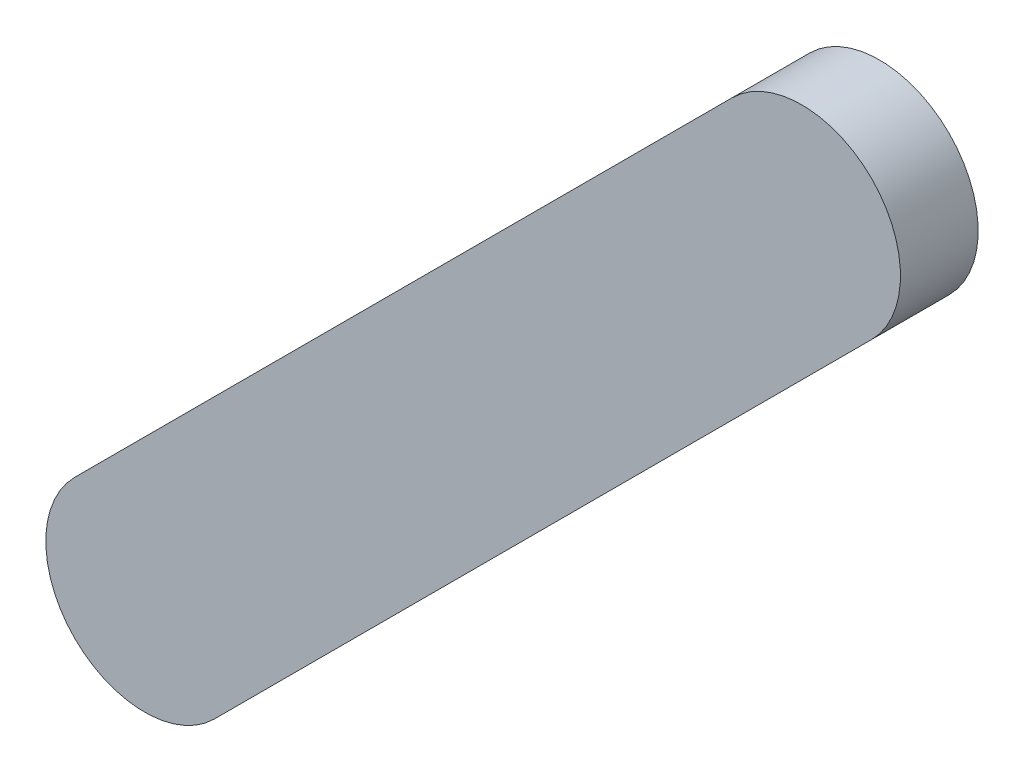
ISO-10303-21;
HEADER;
FILE_DESCRIPTION(('STEP AP214'),'2;1');
FILE_NAME('part.step','',(''),(''),'','','');
FILE_SCHEMA(('AUTOMOTIVE_DESIGN { 1 0 10303 214 1 1 1 1 }'));
ENDSEC;
DATA;
#1=APPLICATION_CONTEXT('core data for automotive mechanical design processes');
#2=APPLICATION_PROTOCOL_DEFINITION('international standard','automotive_design',2000,#1);
#3=PRODUCT_CONTEXT('',#1,'mechanical');
#4=PRODUCT('Part','Part','',(#3));
#5=PRODUCT_RELATED_PRODUCT_CATEGORY('part','',(#4));
#6=PRODUCT_DEFINITION_FORMATION('','',#4);
#7=PRODUCT_DEFINITION_CONTEXT('part definition',#1,'design');
#8=PRODUCT_DEFINITION('design','',#6,#7);
#9=PRODUCT_DEFINITION_SHAPE('','',#8);
#10=(LENGTH_UNIT() NAMED_UNIT(*) SI_UNIT(.MILLI.,.METRE.));
#11=(NAMED_UNIT(*) PLANE_ANGLE_UNIT() SI_UNIT($,.RADIAN.));
#12=(NAMED_UNIT(*) SI_UNIT($,.STERADIAN.) SOLID_ANGLE_UNIT());
#13=UNCERTAINTY_MEASURE_WITH_UNIT(LENGTH_MEASURE(1.E-05),#10,'distance_accuracy_value','');
#14=(GEOMETRIC_REPRESENTATION_CONTEXT(3) GLOBAL_UNCERTAINTY_ASSIGNED_CONTEXT((#13)) GLOBAL_UNIT_ASSIGNED_CONTEXT((#10,
#11,#12)) REPRESENTATION_CONTEXT('',''));
#15=CARTESIAN_POINT('',(0.,0.,0.));
#16=DIRECTION('',(0.,0.,1.));
#17=DIRECTION('',(1.,0.,0.));
#18=AXIS2_PLACEMENT_3D('',#15,#16,#17);
#19=CARTESIAN_POINT('',(146.6209666,107.34895726,0.));
#20=DIRECTION('',(-0.707106781186551,0.707106781186545,0.));
#21=DIRECTION('',(0.707106781186545,0.707106781186551,0.));
#22=AXIS2_PLACEMENT_3D('',#19,#20,#21);
#23=PLANE('',#22);
#24=DIRECTION('',(0.707106781186545,0.707106781186551,0.));
#25=VECTOR('',#24,1.);
#26=CARTESIAN_POINT('',(146.6209666,107.34895726,0.1999996));
#27=LINE('',#26,#25);
#28=CARTESIAN_POINT('',(146.6209666,107.34895726,0.1999996));
#29=VERTEX_POINT('',#28);
#30=CARTESIAN_POINT('',(148.31240594,109.0403966,0.1999996));
#31=VERTEX_POINT('',#30);
#32=EDGE_CURVE('E11',#29,#31,#27,.T.);
#33=ORIENTED_EDGE('',*,*,#32,.F.);
#34=DIRECTION('',(0.,0.,1.));
#35=VECTOR('',#34,1.);
#36=CARTESIAN_POINT('',(146.6209666,107.34895726,0.));
#37=LINE('',#36,#35);
#38=CARTESIAN_POINT('',(146.6209666,107.34895726,0.));
#39=VERTEX_POINT('',#38);
#40=EDGE_CURVE('E24',#39,#29,#37,.T.);
#41=ORIENTED_EDGE('',*,*,#40,.F.);
#42=DIRECTION('',(0.707106781186545,0.707106781186551,0.));
#43=VECTOR('',#42,1.);
#44=CARTESIAN_POINT('',(146.6209666,107.34895726,0.));
#45=LINE('',#44,#43);
#46=CARTESIAN_POINT('',(148.31240594,109.0403966,0.));
#47=VERTEX_POINT('',#46);
#48=EDGE_CURVE('E75',#39,#47,#45,.T.);
#49=ORIENTED_EDGE('',*,*,#48,.T.);
#50=DIRECTION('',(0.,0.,1.));
#51=VECTOR('',#50,1.);
#52=CARTESIAN_POINT('',(148.31240594,109.0403966,0.));
#53=LINE('',#52,#51);
#54=EDGE_CURVE('E37',#47,#31,#53,.T.);
#55=ORIENTED_EDGE('',*,*,#54,.T.);
#56=EDGE_LOOP('',(#33,#41,#49,#55));
#57=FACE_BOUND('',#56,.T.);
#58=ADVANCED_FACE('F17',(#57),#23,.F.);
#59=CARTESIAN_POINT('',(148.13280127,109.22000127,0.));
#60=DIRECTION('',(0.,0.,-1.));
#61=DIRECTION('',(0.70710678118652,-0.707106781186576,0.));
#62=AXIS2_PLACEMENT_3D('',#59,#60,#61);
#63=CYLINDRICAL_SURFACE('',#62,0.253999360179526);
#64=CARTESIAN_POINT('',(148.13280127,109.22000127,0.1999996));
#65=DIRECTION('',(0.,0.,1.));
#66=DIRECTION('',(0.70710678118652,-0.707106781186576,0.));
#67=AXIS2_PLACEMENT_3D('',#64,#65,#66);
#68=CIRCLE('',#67,0.253999360179526);
#69=CARTESIAN_POINT('',(147.9531966,109.39960594,0.1999996));
#70=VERTEX_POINT('',#69);
#71=EDGE_CURVE('E83',#31,#70,#68,.T.);
#72=ORIENTED_EDGE('',*,*,#71,.F.);
#73=ORIENTED_EDGE('',*,*,#54,.F.);
#74=CARTESIAN_POINT('',(148.13280127,109.22000127,0.));
#75=DIRECTION('',(0.,0.,1.));
#76=DIRECTION('',(0.70710678118652,-0.707106781186576,0.));
#77=AXIS2_PLACEMENT_3D('',#74,#75,#76);
#78=CIRCLE('',#77,0.253999360179526);
#79=CARTESIAN_POINT('',(147.9531966,109.39960594,0.));
#80=VERTEX_POINT('',#79);
#81=EDGE_CURVE('E81',#47,#80,#78,.T.);
#82=ORIENTED_EDGE('',*,*,#81,.T.);
#83=DIRECTION('',(0.,0.,1.));
#84=VECTOR('',#83,1.);
#85=CARTESIAN_POINT('',(147.9531966,109.39960594,0.));
#86=LINE('',#85,#84);
#87=EDGE_CURVE('E67',#80,#70,#86,.T.);
#88=ORIENTED_EDGE('',*,*,#87,.T.);
#89=EDGE_LOOP('',(#72,#73,#82,#88));
#90=FACE_BOUND('',#89,.T.);
#91=ADVANCED_FACE('F89',(#90),#63,.T.);
#92=CARTESIAN_POINT('',(147.9531966,109.39960594,0.));
#93=DIRECTION('',(0.707106781186542,-0.707106781186554,0.));
#94=DIRECTION('',(-0.707106781186554,-0.707106781186542,0.));
#95=AXIS2_PLACEMENT_3D('',#92,#93,#94);
#96=PLANE('',#95);
#97=DIRECTION('',(-0.707106781186554,-0.707106781186542,0.));
#98=VECTOR('',#97,1.);
#99=CARTESIAN_POINT('',(147.9531966,109.39960594,0.1999996));
#100=LINE('',#99,#98);
#101=CARTESIAN_POINT('',(146.26175726,107.7081666,0.1999996));
#102=VERTEX_POINT('',#101);
#103=EDGE_CURVE('E71',#70,#102,#100,.T.);
#104=ORIENTED_EDGE('',*,*,#103,.F.);
#105=ORIENTED_EDGE('',*,*,#87,.F.);
#106=DIRECTION('',(-0.707106781186554,-0.707106781186542,0.));
#107=VECTOR('',#106,1.);
#108=CARTESIAN_POINT('',(147.9531966,109.39960594,0.));
#109=LINE('',#108,#107);
#110=CARTESIAN_POINT('',(146.26175726,107.7081666,0.));
#111=VERTEX_POINT('',#110);
#112=EDGE_CURVE('E63',#80,#111,#109,.T.);
#113=ORIENTED_EDGE('',*,*,#112,.T.);
#114=DIRECTION('',(0.,0.,1.));
#115=VECTOR('',#114,1.);
#116=CARTESIAN_POINT('',(146.26175726,107.7081666,0.));
#117=LINE('',#116,#115);
#118=EDGE_CURVE('E53',#111,#102,#117,.T.);
#119=ORIENTED_EDGE('',*,*,#118,.T.);
#120=EDGE_LOOP('',(#104,#105,#113,#119));
#121=FACE_BOUND('',#120,.T.);
#122=ADVANCED_FACE('F66',(#121),#96,.F.);
#123=CARTESIAN_POINT('',(146.44136193,107.52856193,0.));
#124=DIRECTION('',(0.,0.,-1.));
#125=DIRECTION('',(-0.707106781186548,0.707106781186548,0.));
#126=AXIS2_PLACEMENT_3D('',#123,#124,#125);
#127=CYLINDRICAL_SURFACE('',#126,0.253999360179542);
#128=CARTESIAN_POINT('',(146.44136193,107.52856193,0.1999996));
#129=DIRECTION('',(0.,0.,1.));
#130=DIRECTION('',(-0.707106781186548,0.707106781186548,0.));
#131=AXIS2_PLACEMENT_3D('',#128,#129,#130);
#132=CIRCLE('',#131,0.253999360179542);
#133=EDGE_CURVE('E59',#102,#29,#132,.T.);
#134=ORIENTED_EDGE('',*,*,#133,.F.);
#135=ORIENTED_EDGE('',*,*,#118,.F.);
#136=CARTESIAN_POINT('',(146.44136193,107.52856193,0.));
#137=DIRECTION('',(0.,0.,1.));
#138=DIRECTION('',(-0.707106781186548,0.707106781186548,0.));
#139=AXIS2_PLACEMENT_3D('',#136,#137,#138);
#140=CIRCLE('',#139,0.253999360179542);
#141=EDGE_CURVE('E57',#111,#39,#140,.T.);
#142=ORIENTED_EDGE('',*,*,#141,.T.);
#143=ORIENTED_EDGE('',*,*,#40,.T.);
#144=EDGE_LOOP('',(#134,#135,#142,#143));
#145=FACE_BOUND('',#144,.T.);
#146=ADVANCED_FACE('F55',(#145),#127,.T.);
#147=CARTESIAN_POINT('',(146.6209666,107.34895726,0.));
#148=DIRECTION('',(0.,0.,-1.));
#149=DIRECTION('',(-1.,0.,0.));
#150=AXIS2_PLACEMENT_3D('',#147,#148,#149);
#151=PLANE('',#150);
#152=ORIENTED_EDGE('',*,*,#141,.F.);
#153=ORIENTED_EDGE('',*,*,#112,.F.);
#154=ORIENTED_EDGE('',*,*,#81,.F.);
#155=ORIENTED_EDGE('',*,*,#48,.F.);
#156=EDGE_LOOP('',(#152,#153,#154,#155));
#157=FACE_BOUND('',#156,.T.);
#158=ADVANCED_FACE('F74',(#157),#151,.T.);
#159=CARTESIAN_POINT('',(146.6209666,107.34895726,0.1999996));
#160=DIRECTION('',(0.,0.,-1.));
#161=DIRECTION('',(-1.,0.,0.));
#162=AXIS2_PLACEMENT_3D('',#159,#160,#161);
#163=PLANE('',#162);
#164=ORIENTED_EDGE('',*,*,#32,.T.);
#165=ORIENTED_EDGE('',*,*,#71,.T.);
#166=ORIENTED_EDGE('',*,*,#103,.T.);
#167=ORIENTED_EDGE('',*,*,#133,.T.);
#168=EDGE_LOOP('',(#164,#165,#166,#167));
#169=FACE_BOUND('',#168,.T.);
#170=ADVANCED_FACE('F91',(#169),#163,.F.);
#171=CLOSED_SHELL('',(#58,#91,#122,#146,#158,#170));
#172=MANIFOLD_SOLID_BREP('B1',#171);
#173=ADVANCED_BREP_SHAPE_REPRESENTATION('',(#18,#172),#14);
#174=SHAPE_DEFINITION_REPRESENTATION(#9,#173);
ENDSEC;
END-ISO-10303-21;
